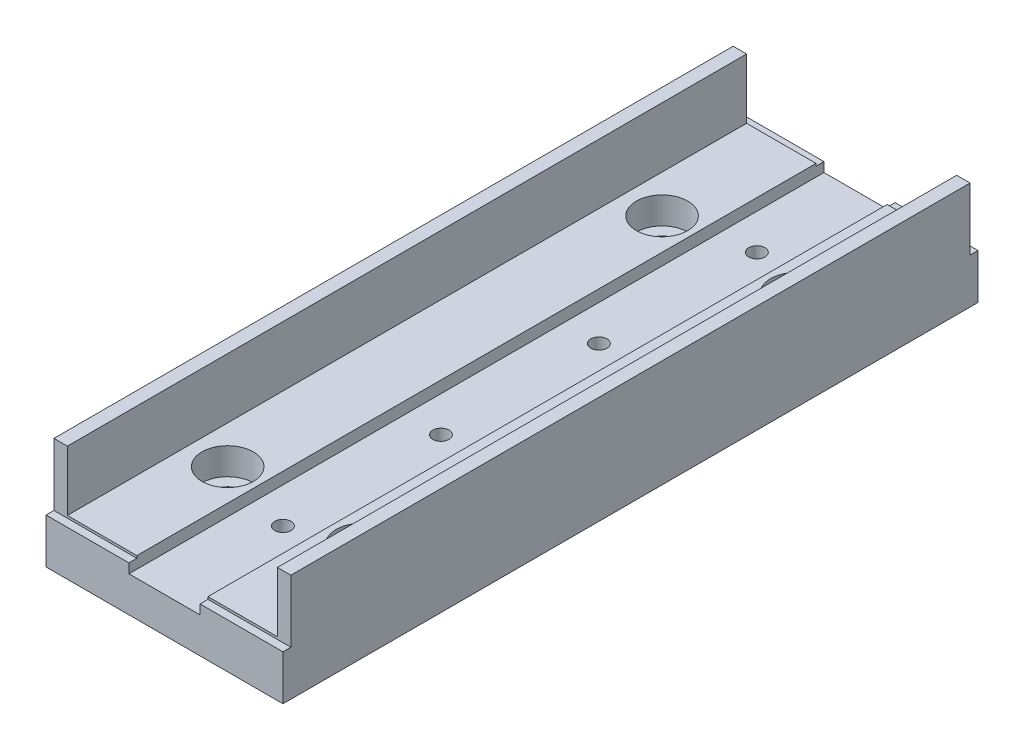
ISO-10303-21;
HEADER;
FILE_DESCRIPTION(('STEP AP214'),'2;1');
FILE_NAME('part.step','',(''),(''),'','','');
FILE_SCHEMA(('AUTOMOTIVE_DESIGN { 1 0 10303 214 1 1 1 1 }'));
ENDSEC;
DATA;
#1=APPLICATION_CONTEXT('core data for automotive mechanical design processes');
#2=APPLICATION_PROTOCOL_DEFINITION('international standard','automotive_design',2000,#1);
#3=PRODUCT_CONTEXT('',#1,'mechanical');
#4=PRODUCT('Part','Part','',(#3));
#5=PRODUCT_RELATED_PRODUCT_CATEGORY('part','',(#4));
#6=PRODUCT_DEFINITION_FORMATION('','',#4);
#7=PRODUCT_DEFINITION_CONTEXT('part definition',#1,'design');
#8=PRODUCT_DEFINITION('design','',#6,#7);
#9=PRODUCT_DEFINITION_SHAPE('','',#8);
#10=(LENGTH_UNIT() NAMED_UNIT(*) SI_UNIT(.MILLI.,.METRE.));
#11=(NAMED_UNIT(*) PLANE_ANGLE_UNIT() SI_UNIT($,.RADIAN.));
#12=(NAMED_UNIT(*) SI_UNIT($,.STERADIAN.) SOLID_ANGLE_UNIT());
#13=UNCERTAINTY_MEASURE_WITH_UNIT(LENGTH_MEASURE(1.E-05),#10,'distance_accuracy_value','');
#14=(GEOMETRIC_REPRESENTATION_CONTEXT(3) GLOBAL_UNCERTAINTY_ASSIGNED_CONTEXT((#13)) GLOBAL_UNIT_ASSIGNED_CONTEXT((#10,
#11,#12)) REPRESENTATION_CONTEXT('',''));
#15=CARTESIAN_POINT('',(0.,0.,0.));
#16=DIRECTION('',(0.,0.,1.));
#17=DIRECTION('',(1.,0.,0.));
#18=AXIS2_PLACEMENT_3D('',#15,#16,#17);
#19=CARTESIAN_POINT('',(-15.,-3.,88.));
#20=DIRECTION('',(0.,1.,0.));
#21=DIRECTION('',(0.,0.,1.));
#22=AXIS2_PLACEMENT_3D('',#19,#20,#21);
#23=PLANE('',#22);
#24=CARTESIAN_POINT('',(0.,-3.,33.));
#25=DIRECTION('',(0.,1.,0.));
#26=DIRECTION('',(0.,0.,1.));
#27=AXIS2_PLACEMENT_3D('',#24,#25,#26);
#28=CIRCLE('',#27,1.025);
#29=CARTESIAN_POINT('',(0.,-3.,34.025));
#30=VERTEX_POINT('',#29);
#31=EDGE_CURVE('E753',#30,#30,#28,.F.);
#32=ORIENTED_EDGE('',*,*,#31,.F.);
#33=EDGE_LOOP('',(#32));
#34=FACE_BOUND('',#33,.T.);
#35=CARTESIAN_POINT('',(0.,-3.,53.));
#36=DIRECTION('',(0.,1.,0.));
#37=DIRECTION('',(0.,0.,1.));
#38=AXIS2_PLACEMENT_3D('',#35,#36,#37);
#39=CIRCLE('',#38,1.025);
#40=CARTESIAN_POINT('',(0.,-3.,54.025));
#41=VERTEX_POINT('',#40);
#42=EDGE_CURVE('E468',#41,#41,#39,.F.);
#43=ORIENTED_EDGE('',*,*,#42,.F.);
#44=EDGE_LOOP('',(#43));
#45=FACE_BOUND('',#44,.T.);
#46=CARTESIAN_POINT('',(0.,-3.,73.));
#47=DIRECTION('',(0.,1.,0.));
#48=DIRECTION('',(0.,0.,1.));
#49=AXIS2_PLACEMENT_3D('',#46,#47,#48);
#50=CIRCLE('',#49,1.025);
#51=CARTESIAN_POINT('',(0.,-3.,74.025));
#52=VERTEX_POINT('',#51);
#53=EDGE_CURVE('E467',#52,#52,#50,.F.);
#54=ORIENTED_EDGE('',*,*,#53,.F.);
#55=EDGE_LOOP('',(#54));
#56=FACE_BOUND('',#55,.T.);
#57=CARTESIAN_POINT('',(-8.50000000000003,-3.,71.5));
#58=DIRECTION('',(0.,1.,0.));
#59=DIRECTION('',(0.,0.,1.));
#60=AXIS2_PLACEMENT_3D('',#57,#58,#59);
#61=CIRCLE('',#60,1.7);
#62=CARTESIAN_POINT('',(-8.50000000000003,-3.,73.2));
#63=VERTEX_POINT('',#62);
#64=EDGE_CURVE('E477',#63,#63,#61,.F.);
#65=ORIENTED_EDGE('',*,*,#64,.F.);
#66=EDGE_LOOP('',(#65));
#67=FACE_BOUND('',#66,.T.);
#68=CARTESIAN_POINT('',(8.49999999999997,-3.,71.5));
#69=DIRECTION('',(0.,1.,0.));
#70=DIRECTION('',(0.,0.,1.));
#71=AXIS2_PLACEMENT_3D('',#68,#69,#70);
#72=CIRCLE('',#71,1.7);
#73=CARTESIAN_POINT('',(8.49999999999997,-3.,73.2));
#74=VERTEX_POINT('',#73);
#75=EDGE_CURVE('E489',#74,#74,#72,.F.);
#76=ORIENTED_EDGE('',*,*,#75,.F.);
#77=EDGE_LOOP('',(#76));
#78=FACE_BOUND('',#77,.T.);
#79=CARTESIAN_POINT('',(8.49999999999997,-3.,16.5));
#80=DIRECTION('',(0.,1.,0.));
#81=DIRECTION('',(0.,0.,1.));
#82=AXIS2_PLACEMENT_3D('',#79,#80,#81);
#83=CIRCLE('',#82,1.7);
#84=CARTESIAN_POINT('',(8.49999999999997,-3.,18.2));
#85=VERTEX_POINT('',#84);
#86=EDGE_CURVE('E501',#85,#85,#83,.F.);
#87=ORIENTED_EDGE('',*,*,#86,.F.);
#88=EDGE_LOOP('',(#87));
#89=FACE_BOUND('',#88,.T.);
#90=CARTESIAN_POINT('',(-8.50000000000003,-3.,16.5));
#91=DIRECTION('',(0.,1.,0.));
#92=DIRECTION('',(0.,0.,1.));
#93=AXIS2_PLACEMENT_3D('',#90,#91,#92);
#94=CIRCLE('',#93,1.7);
#95=CARTESIAN_POINT('',(-8.50000000000003,-3.,18.2));
#96=VERTEX_POINT('',#95);
#97=EDGE_CURVE('E352',#96,#96,#94,.F.);
#98=ORIENTED_EDGE('',*,*,#97,.F.);
#99=EDGE_LOOP('',(#98));
#100=FACE_BOUND('',#99,.T.);
#101=DIRECTION('',(1.,0.,0.));
#102=VECTOR('',#101,1.);
#103=CARTESIAN_POINT('',(-15.,-3.,0.));
#104=LINE('',#103,#102);
#105=CARTESIAN_POINT('',(-15.,-3.,0.));
#106=VERTEX_POINT('',#105);
#107=CARTESIAN_POINT('',(15.,-3.,0.));
#108=VERTEX_POINT('',#107);
#109=EDGE_CURVE('E209',#106,#108,#104,.T.);
#110=ORIENTED_EDGE('',*,*,#109,.T.);
#111=DIRECTION('',(0.,0.,-1.));
#112=VECTOR('',#111,1.);
#113=CARTESIAN_POINT('',(15.,-3.,88.));
#114=LINE('',#113,#112);
#115=CARTESIAN_POINT('',(15.,-3.,88.));
#116=VERTEX_POINT('',#115);
#117=EDGE_CURVE('E222',#116,#108,#114,.T.);
#118=ORIENTED_EDGE('',*,*,#117,.F.);
#119=DIRECTION('',(1.,0.,0.));
#120=VECTOR('',#119,1.);
#121=CARTESIAN_POINT('',(-15.,-3.,88.));
#122=LINE('',#121,#120);
#123=CARTESIAN_POINT('',(-15.,-3.,88.));
#124=VERTEX_POINT('',#123);
#125=EDGE_CURVE('E201',#124,#116,#122,.T.);
#126=ORIENTED_EDGE('',*,*,#125,.F.);
#127=DIRECTION('',(0.,0.,-1.));
#128=VECTOR('',#127,1.);
#129=CARTESIAN_POINT('',(-15.,-3.,88.));
#130=LINE('',#129,#128);
#131=EDGE_CURVE('E234',#124,#106,#130,.T.);
#132=ORIENTED_EDGE('',*,*,#131,.T.);
#133=EDGE_LOOP('',(#110,#118,#126,#132));
#134=FACE_BOUND('',#133,.T.);
#135=CARTESIAN_POINT('',(0.,-3.,13.));
#136=DIRECTION('',(0.,1.,0.));
#137=DIRECTION('',(0.,0.,1.));
#138=AXIS2_PLACEMENT_3D('',#135,#136,#137);
#139=CIRCLE('',#138,1.025);
#140=CARTESIAN_POINT('',(0.,-3.,14.025));
#141=VERTEX_POINT('',#140);
#142=EDGE_CURVE('E749',#141,#141,#139,.F.);
#143=ORIENTED_EDGE('',*,*,#142,.F.);
#144=EDGE_LOOP('',(#143));
#145=FACE_BOUND('',#144,.T.);
#146=ADVANCED_FACE('F48',(#34,#45,#56,#67,#78,#89,#100,#134,#145),#23,.F.);
#147=CARTESIAN_POINT('',(15.,10.6,88.));
#148=DIRECTION('',(0.,-1.,0.));
#149=DIRECTION('',(0.,0.,-1.));
#150=AXIS2_PLACEMENT_3D('',#147,#148,#149);
#151=PLANE('',#150);
#152=DIRECTION('',(0.,0.,-1.));
#153=VECTOR('',#152,1.);
#154=CARTESIAN_POINT('',(13.3,10.6,88.));
#155=LINE('',#154,#153);
#156=CARTESIAN_POINT('',(13.3,10.6,87.));
#157=VERTEX_POINT('',#156);
#158=CARTESIAN_POINT('',(13.3,10.6,1.));
#159=VERTEX_POINT('',#158);
#160=EDGE_CURVE('E261',#157,#159,#155,.T.);
#161=ORIENTED_EDGE('',*,*,#160,.F.);
#162=DIRECTION('',(-1.,0.,0.));
#163=VECTOR('',#162,1.);
#164=CARTESIAN_POINT('',(-15.,10.6,87.));
#165=LINE('',#164,#163);
#166=CARTESIAN_POINT('',(15.,10.6,87.));
#167=VERTEX_POINT('',#166);
#168=EDGE_CURVE('E346',#167,#157,#165,.T.);
#169=ORIENTED_EDGE('',*,*,#168,.F.);
#170=DIRECTION('',(0.,0.,-1.));
#171=VECTOR('',#170,1.);
#172=CARTESIAN_POINT('',(15.,10.6,88.));
#173=LINE('',#172,#171);
#174=CARTESIAN_POINT('',(14.9999999999999,10.6,1.));
#175=VERTEX_POINT('',#174);
#176=EDGE_CURVE('E264',#167,#175,#173,.T.);
#177=ORIENTED_EDGE('',*,*,#176,.T.);
#178=DIRECTION('',(1.,0.,0.));
#179=VECTOR('',#178,1.);
#180=CARTESIAN_POINT('',(-15.,10.6,1.));
#181=LINE('',#180,#179);
#182=EDGE_CURVE('E347',#159,#175,#181,.T.);
#183=ORIENTED_EDGE('',*,*,#182,.F.);
#184=EDGE_LOOP('',(#161,#169,#177,#183));
#185=FACE_BOUND('',#184,.T.);
#186=ADVANCED_FACE('F50',(#185),#151,.F.);
#187=CARTESIAN_POINT('',(13.3,3.00000000000009,88.));
#188=DIRECTION('',(1.,0.,0.));
#189=DIRECTION('',(0.,1.,0.));
#190=AXIS2_PLACEMENT_3D('',#187,#188,#189);
#191=PLANE('',#190);
#192=DIRECTION('',(0.,0.,-1.));
#193=VECTOR('',#192,1.);
#194=CARTESIAN_POINT('',(13.3,3.00000000000009,88.));
#195=LINE('',#194,#193);
#196=CARTESIAN_POINT('',(13.3,3.00000000000009,87.));
#197=VERTEX_POINT('',#196);
#198=CARTESIAN_POINT('',(13.3,3.00000000000009,1.));
#199=VERTEX_POINT('',#198);
#200=EDGE_CURVE('E258',#197,#199,#195,.T.);
#201=ORIENTED_EDGE('',*,*,#200,.F.);
#202=DIRECTION('',(0.,1.,0.));
#203=VECTOR('',#202,1.);
#204=CARTESIAN_POINT('',(13.3,3.00000000000009,87.));
#205=LINE('',#204,#203);
#206=EDGE_CURVE('E212',#197,#157,#205,.T.);
#207=ORIENTED_EDGE('',*,*,#206,.T.);
#208=ORIENTED_EDGE('',*,*,#160,.T.);
#209=DIRECTION('',(0.,-1.,0.));
#210=VECTOR('',#209,1.);
#211=CARTESIAN_POINT('',(13.3,3.00000000000009,1.));
#212=LINE('',#211,#210);
#213=EDGE_CURVE('E320',#159,#199,#212,.T.);
#214=ORIENTED_EDGE('',*,*,#213,.T.);
#215=EDGE_LOOP('',(#201,#207,#208,#214));
#216=FACE_BOUND('',#215,.T.);
#217=ADVANCED_FACE('F341',(#216),#191,.F.);
#218=CARTESIAN_POINT('',(4.5,3.,88.));
#219=DIRECTION('',(0.,-1.,0.));
#220=DIRECTION('',(1.,0.,0.));
#221=AXIS2_PLACEMENT_3D('',#218,#219,#220);
#222=PLANE('',#221);
#223=CARTESIAN_POINT('',(8.49999999999997,3.00000000000004,71.5));
#224=DIRECTION('',(0.,1.,0.));
#225=DIRECTION('',(0.,0.,1.));
#226=AXIS2_PLACEMENT_3D('',#223,#224,#225);
#227=CIRCLE('',#226,3.25);
#228=CARTESIAN_POINT('',(8.49999999999997,3.00000000000004,74.75));
#229=VERTEX_POINT('',#228);
#230=EDGE_CURVE('E480',#229,#229,#227,.T.);
#231=ORIENTED_EDGE('',*,*,#230,.F.);
#232=EDGE_LOOP('',(#231));
#233=FACE_BOUND('',#232,.T.);
#234=CARTESIAN_POINT('',(8.49999999999997,3.00000000000004,16.5));
#235=DIRECTION('',(0.,1.,0.));
#236=DIRECTION('',(0.,0.,1.));
#237=AXIS2_PLACEMENT_3D('',#234,#235,#236);
#238=CIRCLE('',#237,3.25);
#239=CARTESIAN_POINT('',(8.49999999999997,3.00000000000004,19.75));
#240=VERTEX_POINT('',#239);
#241=EDGE_CURVE('E492',#240,#240,#238,.T.);
#242=ORIENTED_EDGE('',*,*,#241,.F.);
#243=EDGE_LOOP('',(#242));
#244=FACE_BOUND('',#243,.T.);
#245=DIRECTION('',(0.,0.,-1.));
#246=VECTOR('',#245,1.);
#247=CARTESIAN_POINT('',(4.5,3.,88.));
#248=LINE('',#247,#246);
#249=CARTESIAN_POINT('',(4.5,3.,87.));
#250=VERTEX_POINT('',#249);
#251=CARTESIAN_POINT('',(4.5,3.,1.));
#252=VERTEX_POINT('',#251);
#253=EDGE_CURVE('E255',#250,#252,#248,.T.);
#254=ORIENTED_EDGE('',*,*,#253,.F.);
#255=DIRECTION('',(1.,0.,0.));
#256=VECTOR('',#255,1.);
#257=CARTESIAN_POINT('',(4.5,3.,87.));
#258=LINE('',#257,#256);
#259=EDGE_CURVE('E333',#250,#197,#258,.T.);
#260=ORIENTED_EDGE('',*,*,#259,.T.);
#261=ORIENTED_EDGE('',*,*,#200,.T.);
#262=DIRECTION('',(-1.,0.,0.));
#263=VECTOR('',#262,1.);
#264=CARTESIAN_POINT('',(4.5,3.,1.));
#265=LINE('',#264,#263);
#266=EDGE_CURVE('E317',#199,#252,#265,.T.);
#267=ORIENTED_EDGE('',*,*,#266,.T.);
#268=EDGE_LOOP('',(#254,#260,#261,#267));
#269=FACE_BOUND('',#268,.T.);
#270=ADVANCED_FACE('F411',(#233,#244,#269),#222,.F.);
#271=CARTESIAN_POINT('',(4.5,1.5,88.));
#272=DIRECTION('',(1.,0.,0.));
#273=DIRECTION('',(0.,1.,0.));
#274=AXIS2_PLACEMENT_3D('',#271,#272,#273);
#275=PLANE('',#274);
#276=DIRECTION('',(0.,-1.,0.));
#277=VECTOR('',#276,1.);
#278=CARTESIAN_POINT('',(4.5,1.5,88.));
#279=LINE('',#278,#277);
#280=CARTESIAN_POINT('',(4.5,2.7,88.));
#281=VERTEX_POINT('',#280);
#282=CARTESIAN_POINT('',(4.5,1.5,88.));
#283=VERTEX_POINT('',#282);
#284=EDGE_CURVE('E203',#281,#283,#279,.T.);
#285=ORIENTED_EDGE('',*,*,#284,.F.);
#286=DIRECTION('',(0.,0.,-1.));
#287=VECTOR('',#286,1.);
#288=CARTESIAN_POINT('',(4.5,2.7,88.));
#289=LINE('',#288,#287);
#290=CARTESIAN_POINT('',(4.5,2.7,87.));
#291=VERTEX_POINT('',#290);
#292=EDGE_CURVE('E70',#281,#291,#289,.T.);
#293=ORIENTED_EDGE('',*,*,#292,.T.);
#294=DIRECTION('',(0.,1.,0.));
#295=VECTOR('',#294,1.);
#296=CARTESIAN_POINT('',(4.5,1.5,87.));
#297=LINE('',#296,#295);
#298=EDGE_CURVE('E331',#291,#250,#297,.T.);
#299=ORIENTED_EDGE('',*,*,#298,.T.);
#300=ORIENTED_EDGE('',*,*,#253,.T.);
#301=DIRECTION('',(0.,-1.,0.));
#302=VECTOR('',#301,1.);
#303=CARTESIAN_POINT('',(4.5,1.5,1.));
#304=LINE('',#303,#302);
#305=CARTESIAN_POINT('',(4.5,2.7,1.));
#306=VERTEX_POINT('',#305);
#307=EDGE_CURVE('E298',#252,#306,#304,.T.);
#308=ORIENTED_EDGE('',*,*,#307,.T.);
#309=DIRECTION('',(0.,0.,-1.));
#310=VECTOR('',#309,1.);
#311=CARTESIAN_POINT('',(4.5,2.7,88.));
#312=LINE('',#311,#310);
#313=CARTESIAN_POINT('',(4.5,2.7,0.));
#314=VERTEX_POINT('',#313);
#315=EDGE_CURVE('E297',#306,#314,#312,.T.);
#316=ORIENTED_EDGE('',*,*,#315,.T.);
#317=DIRECTION('',(0.,-1.,0.));
#318=VECTOR('',#317,1.);
#319=CARTESIAN_POINT('',(4.5,1.5,0.));
#320=LINE('',#319,#318);
#321=CARTESIAN_POINT('',(4.5,1.5,0.));
#322=VERTEX_POINT('',#321);
#323=EDGE_CURVE('E223',#314,#322,#320,.T.);
#324=ORIENTED_EDGE('',*,*,#323,.T.);
#325=DIRECTION('',(0.,0.,-1.));
#326=VECTOR('',#325,1.);
#327=CARTESIAN_POINT('',(4.5,1.5,88.));
#328=LINE('',#327,#326);
#329=EDGE_CURVE('E252',#283,#322,#328,.T.);
#330=ORIENTED_EDGE('',*,*,#329,.F.);
#331=EDGE_LOOP('',(#285,#293,#299,#300,#308,#316,#324,#330));
#332=FACE_BOUND('',#331,.T.);
#333=ADVANCED_FACE('F295',(#332),#275,.F.);
#334=CARTESIAN_POINT('',(-4.5,1.5,88.));
#335=DIRECTION('',(0.,-1.,0.));
#336=DIRECTION('',(1.,0.,0.));
#337=AXIS2_PLACEMENT_3D('',#334,#335,#336);
#338=PLANE('',#337);
#339=CARTESIAN_POINT('',(0.,1.5,13.));
#340=DIRECTION('',(0.,1.,0.));
#341=DIRECTION('',(0.,0.,1.));
#342=AXIS2_PLACEMENT_3D('',#339,#340,#341);
#343=CIRCLE('',#342,1.025);
#344=CARTESIAN_POINT('',(0.,1.5,14.025));
#345=VERTEX_POINT('',#344);
#346=EDGE_CURVE('E454',#345,#345,#343,.T.);
#347=ORIENTED_EDGE('',*,*,#346,.F.);
#348=EDGE_LOOP('',(#347));
#349=FACE_BOUND('',#348,.T.);
#350=CARTESIAN_POINT('',(0.,1.5,33.));
#351=DIRECTION('',(0.,1.,0.));
#352=DIRECTION('',(0.,0.,1.));
#353=AXIS2_PLACEMENT_3D('',#350,#351,#352);
#354=CIRCLE('',#353,1.025);
#355=CARTESIAN_POINT('',(0.,1.5,34.025));
#356=VERTEX_POINT('',#355);
#357=EDGE_CURVE('E458',#356,#356,#354,.T.);
#358=ORIENTED_EDGE('',*,*,#357,.F.);
#359=EDGE_LOOP('',(#358));
#360=FACE_BOUND('',#359,.T.);
#361=CARTESIAN_POINT('',(0.,1.5,53.));
#362=DIRECTION('',(0.,1.,0.));
#363=DIRECTION('',(0.,0.,1.));
#364=AXIS2_PLACEMENT_3D('',#361,#362,#363);
#365=CIRCLE('',#364,1.025);
#366=CARTESIAN_POINT('',(0.,1.5,54.025));
#367=VERTEX_POINT('',#366);
#368=EDGE_CURVE('E462',#367,#367,#365,.T.);
#369=ORIENTED_EDGE('',*,*,#368,.F.);
#370=EDGE_LOOP('',(#369));
#371=FACE_BOUND('',#370,.T.);
#372=CARTESIAN_POINT('',(0.,1.5,73.));
#373=DIRECTION('',(0.,1.,0.));
#374=DIRECTION('',(0.,0.,1.));
#375=AXIS2_PLACEMENT_3D('',#372,#373,#374);
#376=CIRCLE('',#375,1.025);
#377=CARTESIAN_POINT('',(0.,1.5,74.025));
#378=VERTEX_POINT('',#377);
#379=EDGE_CURVE('E465',#378,#378,#376,.T.);
#380=ORIENTED_EDGE('',*,*,#379,.F.);
#381=EDGE_LOOP('',(#380));
#382=FACE_BOUND('',#381,.T.);
#383=DIRECTION('',(-1.,0.,0.));
#384=VECTOR('',#383,1.);
#385=CARTESIAN_POINT('',(-4.5,1.5,0.));
#386=LINE('',#385,#384);
#387=CARTESIAN_POINT('',(-4.5,1.5,0.));
#388=VERTEX_POINT('',#387);
#389=EDGE_CURVE('E225',#322,#388,#386,.T.);
#390=ORIENTED_EDGE('',*,*,#389,.T.);
#391=DIRECTION('',(0.,0.,-1.));
#392=VECTOR('',#391,1.);
#393=CARTESIAN_POINT('',(-4.5,1.5,88.));
#394=LINE('',#393,#392);
#395=CARTESIAN_POINT('',(-4.5,1.5,88.));
#396=VERTEX_POINT('',#395);
#397=EDGE_CURVE('E249',#396,#388,#394,.T.);
#398=ORIENTED_EDGE('',*,*,#397,.F.);
#399=DIRECTION('',(-1.,0.,0.));
#400=VECTOR('',#399,1.);
#401=CARTESIAN_POINT('',(-4.5,1.5,88.));
#402=LINE('',#401,#400);
#403=EDGE_CURVE('E206',#283,#396,#402,.T.);
#404=ORIENTED_EDGE('',*,*,#403,.F.);
#405=ORIENTED_EDGE('',*,*,#329,.T.);
#406=EDGE_LOOP('',(#390,#398,#404,#405));
#407=FACE_BOUND('',#406,.T.);
#408=ADVANCED_FACE('F287',(#349,#360,#371,#382,#407),#338,.F.);
#409=CARTESIAN_POINT('',(-4.5,3.,88.));
#410=DIRECTION('',(-1.,0.,0.));
#411=DIRECTION('',(0.,0.,1.));
#412=AXIS2_PLACEMENT_3D('',#409,#410,#411);
#413=PLANE('',#412);
#414=DIRECTION('',(0.,-1.,0.));
#415=VECTOR('',#414,1.);
#416=CARTESIAN_POINT('',(-4.5,3.,87.));
#417=LINE('',#416,#415);
#418=CARTESIAN_POINT('',(-4.5,3.,87.));
#419=VERTEX_POINT('',#418);
#420=CARTESIAN_POINT('',(-4.5,2.7,87.));
#421=VERTEX_POINT('',#420);
#422=EDGE_CURVE('E329',#419,#421,#417,.T.);
#423=ORIENTED_EDGE('',*,*,#422,.T.);
#424=DIRECTION('',(0.,0.,1.));
#425=VECTOR('',#424,1.);
#426=CARTESIAN_POINT('',(-4.5,2.7,88.));
#427=LINE('',#426,#425);
#428=CARTESIAN_POINT('',(-4.5,2.7,88.));
#429=VERTEX_POINT('',#428);
#430=EDGE_CURVE('E301',#421,#429,#427,.T.);
#431=ORIENTED_EDGE('',*,*,#430,.T.);
#432=DIRECTION('',(0.,1.,0.));
#433=VECTOR('',#432,1.);
#434=CARTESIAN_POINT('',(-4.5,3.,88.));
#435=LINE('',#434,#433);
#436=EDGE_CURVE('E216',#396,#429,#435,.T.);
#437=ORIENTED_EDGE('',*,*,#436,.F.);
#438=ORIENTED_EDGE('',*,*,#397,.T.);
#439=DIRECTION('',(0.,1.,0.));
#440=VECTOR('',#439,1.);
#441=CARTESIAN_POINT('',(-4.5,3.,0.));
#442=LINE('',#441,#440);
#443=CARTESIAN_POINT('',(-4.5,2.7,0.));
#444=VERTEX_POINT('',#443);
#445=EDGE_CURVE('E227',#388,#444,#442,.T.);
#446=ORIENTED_EDGE('',*,*,#445,.T.);
#447=DIRECTION('',(0.,0.,1.));
#448=VECTOR('',#447,1.);
#449=CARTESIAN_POINT('',(-4.5,2.7,88.));
#450=LINE('',#449,#448);
#451=CARTESIAN_POINT('',(-4.5,2.7,1.));
#452=VERTEX_POINT('',#451);
#453=EDGE_CURVE('E281',#444,#452,#450,.T.);
#454=ORIENTED_EDGE('',*,*,#453,.T.);
#455=DIRECTION('',(0.,1.,0.));
#456=VECTOR('',#455,1.);
#457=CARTESIAN_POINT('',(-4.5,3.,1.));
#458=LINE('',#457,#456);
#459=CARTESIAN_POINT('',(-4.5,3.,1.));
#460=VERTEX_POINT('',#459);
#461=EDGE_CURVE('E314',#452,#460,#458,.T.);
#462=ORIENTED_EDGE('',*,*,#461,.T.);
#463=DIRECTION('',(0.,0.,-1.));
#464=VECTOR('',#463,1.);
#465=CARTESIAN_POINT('',(-4.5,3.,88.));
#466=LINE('',#465,#464);
#467=EDGE_CURVE('E246',#419,#460,#466,.T.);
#468=ORIENTED_EDGE('',*,*,#467,.F.);
#469=EDGE_LOOP('',(#423,#431,#437,#438,#446,#454,#462,#468));
#470=FACE_BOUND('',#469,.T.);
#471=ADVANCED_FACE('F279',(#470),#413,.F.);
#472=CARTESIAN_POINT('',(-13.3,3.,88.));
#473=DIRECTION('',(0.,-1.,0.));
#474=DIRECTION('',(0.,0.,-1.));
#475=AXIS2_PLACEMENT_3D('',#472,#473,#474);
#476=PLANE('',#475);
#477=CARTESIAN_POINT('',(-8.50000000000003,2.99999999999986,71.5));
#478=DIRECTION('',(0.,1.,0.));
#479=DIRECTION('',(0.,0.,1.));
#480=AXIS2_PLACEMENT_3D('',#477,#478,#479);
#481=CIRCLE('',#480,3.25);
#482=CARTESIAN_POINT('',(-8.50000000000003,2.99999999999986,74.75));
#483=VERTEX_POINT('',#482);
#484=EDGE_CURVE('E471',#483,#483,#481,.T.);
#485=ORIENTED_EDGE('',*,*,#484,.F.);
#486=EDGE_LOOP('',(#485));
#487=FACE_BOUND('',#486,.T.);
#488=CARTESIAN_POINT('',(-8.50000000000003,2.99999999999986,16.5));
#489=DIRECTION('',(0.,1.,0.));
#490=DIRECTION('',(0.,0.,1.));
#491=AXIS2_PLACEMENT_3D('',#488,#489,#490);
#492=CIRCLE('',#491,3.25);
#493=CARTESIAN_POINT('',(-8.50000000000003,2.99999999999986,19.75));
#494=VERTEX_POINT('',#493);
#495=EDGE_CURVE('E504',#494,#494,#492,.T.);
#496=ORIENTED_EDGE('',*,*,#495,.F.);
#497=EDGE_LOOP('',(#496));
#498=FACE_BOUND('',#497,.T.);
#499=DIRECTION('',(0.,0.,-1.));
#500=VECTOR('',#499,1.);
#501=CARTESIAN_POINT('',(-13.3,3.,88.));
#502=LINE('',#501,#500);
#503=CARTESIAN_POINT('',(-13.3,3.,87.));
#504=VERTEX_POINT('',#503);
#505=CARTESIAN_POINT('',(-13.3,3.,1.));
#506=VERTEX_POINT('',#505);
#507=EDGE_CURVE('E243',#504,#506,#502,.T.);
#508=ORIENTED_EDGE('',*,*,#507,.F.);
#509=DIRECTION('',(1.,0.,0.));
#510=VECTOR('',#509,1.);
#511=CARTESIAN_POINT('',(-13.3,3.,87.));
#512=LINE('',#511,#510);
#513=EDGE_CURVE('E326',#504,#419,#512,.T.);
#514=ORIENTED_EDGE('',*,*,#513,.T.);
#515=ORIENTED_EDGE('',*,*,#467,.T.);
#516=DIRECTION('',(-1.,0.,0.));
#517=VECTOR('',#516,1.);
#518=CARTESIAN_POINT('',(-13.3,3.,1.));
#519=LINE('',#518,#517);
#520=EDGE_CURVE('E311',#460,#506,#519,.T.);
#521=ORIENTED_EDGE('',*,*,#520,.T.);
#522=EDGE_LOOP('',(#508,#514,#515,#521));
#523=FACE_BOUND('',#522,.T.);
#524=ADVANCED_FACE('F389',(#487,#498,#523),#476,.F.);
#525=CARTESIAN_POINT('',(-13.3,3.,88.));
#526=DIRECTION('',(-1.,0.,0.));
#527=DIRECTION('',(0.,0.,1.));
#528=AXIS2_PLACEMENT_3D('',#525,#526,#527);
#529=PLANE('',#528);
#530=DIRECTION('',(0.,0.,-1.));
#531=VECTOR('',#530,1.);
#532=CARTESIAN_POINT('',(-13.3,10.6,88.));
#533=LINE('',#532,#531);
#534=CARTESIAN_POINT('',(-13.3,10.6,87.));
#535=VERTEX_POINT('',#534);
#536=CARTESIAN_POINT('',(-13.3,10.6,1.));
#537=VERTEX_POINT('',#536);
#538=EDGE_CURVE('E240',#535,#537,#533,.T.);
#539=ORIENTED_EDGE('',*,*,#538,.F.);
#540=DIRECTION('',(0.,-1.,0.));
#541=VECTOR('',#540,1.);
#542=CARTESIAN_POINT('',(-13.3,3.,87.));
#543=LINE('',#542,#541);
#544=EDGE_CURVE('E323',#535,#504,#543,.T.);
#545=ORIENTED_EDGE('',*,*,#544,.T.);
#546=ORIENTED_EDGE('',*,*,#507,.T.);
#547=DIRECTION('',(0.,1.,0.));
#548=VECTOR('',#547,1.);
#549=CARTESIAN_POINT('',(-13.3,3.,1.));
#550=LINE('',#549,#548);
#551=EDGE_CURVE('E308',#506,#537,#550,.T.);
#552=ORIENTED_EDGE('',*,*,#551,.T.);
#553=EDGE_LOOP('',(#539,#545,#546,#552));
#554=FACE_BOUND('',#553,.T.);
#555=ADVANCED_FACE('F396',(#554),#529,.F.);
#556=CARTESIAN_POINT('',(-15.,10.6,88.));
#557=DIRECTION('',(0.,-1.,0.));
#558=DIRECTION('',(0.,0.,-1.));
#559=AXIS2_PLACEMENT_3D('',#556,#557,#558);
#560=PLANE('',#559);
#561=DIRECTION('',(0.,0.,-1.));
#562=VECTOR('',#561,1.);
#563=CARTESIAN_POINT('',(-15.,10.6,88.));
#564=LINE('',#563,#562);
#565=CARTESIAN_POINT('',(-15.,10.6,87.));
#566=VERTEX_POINT('',#565);
#567=CARTESIAN_POINT('',(-15.,10.6,1.));
#568=VERTEX_POINT('',#567);
#569=EDGE_CURVE('E237',#566,#568,#564,.T.);
#570=ORIENTED_EDGE('',*,*,#569,.F.);
#571=EDGE_CURVE('E364',#535,#566,#165,.T.);
#572=ORIENTED_EDGE('',*,*,#571,.F.);
#573=ORIENTED_EDGE('',*,*,#538,.T.);
#574=EDGE_CURVE('E351',#568,#537,#181,.T.);
#575=ORIENTED_EDGE('',*,*,#574,.F.);
#576=EDGE_LOOP('',(#570,#572,#573,#575));
#577=FACE_BOUND('',#576,.T.);
#578=ADVANCED_FACE('F399',(#577),#560,.F.);
#579=CARTESIAN_POINT('',(-15.,-3.,88.));
#580=DIRECTION('',(1.,0.,0.));
#581=DIRECTION('',(0.,0.,-1.));
#582=AXIS2_PLACEMENT_3D('',#579,#580,#581);
#583=PLANE('',#582);
#584=DIRECTION('',(0.,-1.,0.));
#585=VECTOR('',#584,1.);
#586=CARTESIAN_POINT('',(-15.,3.,88.));
#587=LINE('',#586,#585);
#588=CARTESIAN_POINT('',(-15.,2.7,88.));
#589=VERTEX_POINT('',#588);
#590=EDGE_CURVE('E219',#589,#124,#587,.T.);
#591=ORIENTED_EDGE('',*,*,#590,.F.);
#592=DIRECTION('',(0.,0.,1.));
#593=VECTOR('',#592,1.);
#594=CARTESIAN_POINT('',(-15.,2.7,88.));
#595=LINE('',#594,#593);
#596=CARTESIAN_POINT('',(-15.,2.7,87.));
#597=VERTEX_POINT('',#596);
#598=EDGE_CURVE('E63',#597,#589,#595,.T.);
#599=ORIENTED_EDGE('',*,*,#598,.F.);
#600=DIRECTION('',(0.,1.,0.));
#601=VECTOR('',#600,1.);
#602=CARTESIAN_POINT('',(-15.,-27.6166620396073,87.));
#603=LINE('',#602,#601);
#604=EDGE_CURVE('E408',#597,#566,#603,.T.);
#605=ORIENTED_EDGE('',*,*,#604,.T.);
#606=ORIENTED_EDGE('',*,*,#569,.T.);
#607=DIRECTION('',(0.,1.,0.));
#608=VECTOR('',#607,1.);
#609=CARTESIAN_POINT('',(-15.,-27.6166620396073,1.));
#610=LINE('',#609,#608);
#611=CARTESIAN_POINT('',(-15.,2.7,1.));
#612=VERTEX_POINT('',#611);
#613=EDGE_CURVE('E362',#612,#568,#610,.T.);
#614=ORIENTED_EDGE('',*,*,#613,.F.);
#615=DIRECTION('',(0.,0.,1.));
#616=VECTOR('',#615,1.);
#617=CARTESIAN_POINT('',(-15.,2.7,0.));
#618=LINE('',#617,#616);
#619=CARTESIAN_POINT('',(-15.,2.7,0.));
#620=VERTEX_POINT('',#619);
#621=EDGE_CURVE('E354',#620,#612,#618,.T.);
#622=ORIENTED_EDGE('',*,*,#621,.F.);
#623=DIRECTION('',(0.,-1.,0.));
#624=VECTOR('',#623,1.);
#625=CARTESIAN_POINT('',(-15.,-3.,0.));
#626=LINE('',#625,#624);
#627=EDGE_CURVE('E230',#620,#106,#626,.T.);
#628=ORIENTED_EDGE('',*,*,#627,.T.);
#629=ORIENTED_EDGE('',*,*,#131,.F.);
#630=EDGE_LOOP('',(#591,#599,#605,#606,#614,#622,#628,#629));
#631=FACE_BOUND('',#630,.T.);
#632=ADVANCED_FACE('F383',(#631),#583,.F.);
#633=CARTESIAN_POINT('',(15.,-3.,88.));
#634=DIRECTION('',(-1.,0.,0.));
#635=DIRECTION('',(0.,0.,1.));
#636=AXIS2_PLACEMENT_3D('',#633,#634,#635);
#637=PLANE('',#636);
#638=DIRECTION('',(0.,1.,0.));
#639=VECTOR('',#638,1.);
#640=CARTESIAN_POINT('',(15.,-27.6166620396073,87.));
#641=LINE('',#640,#639);
#642=CARTESIAN_POINT('',(15.,2.7,87.));
#643=VERTEX_POINT('',#642);
#644=EDGE_CURVE('E196',#643,#167,#641,.T.);
#645=ORIENTED_EDGE('',*,*,#644,.F.);
#646=DIRECTION('',(0.,0.,-1.));
#647=VECTOR('',#646,1.);
#648=CARTESIAN_POINT('',(15.,2.7,88.));
#649=LINE('',#648,#647);
#650=CARTESIAN_POINT('',(15.,2.7,88.));
#651=VERTEX_POINT('',#650);
#652=EDGE_CURVE('E185',#651,#643,#649,.T.);
#653=ORIENTED_EDGE('',*,*,#652,.F.);
#654=DIRECTION('',(0.,1.,0.));
#655=VECTOR('',#654,1.);
#656=CARTESIAN_POINT('',(15.,3.,88.));
#657=LINE('',#656,#655);
#658=EDGE_CURVE('E193',#116,#651,#657,.T.);
#659=ORIENTED_EDGE('',*,*,#658,.F.);
#660=ORIENTED_EDGE('',*,*,#117,.T.);
#661=DIRECTION('',(0.,1.,0.));
#662=VECTOR('',#661,1.);
#663=CARTESIAN_POINT('',(15.,-3.,0.));
#664=LINE('',#663,#662);
#665=CARTESIAN_POINT('',(15.,2.7,0.));
#666=VERTEX_POINT('',#665);
#667=EDGE_CURVE('E204',#108,#666,#664,.T.);
#668=ORIENTED_EDGE('',*,*,#667,.T.);
#669=DIRECTION('',(0.,0.,-1.));
#670=VECTOR('',#669,1.);
#671=CARTESIAN_POINT('',(14.9999999999999,2.7,0.));
#672=LINE('',#671,#670);
#673=CARTESIAN_POINT('',(14.9999999999999,2.7,1.));
#674=VERTEX_POINT('',#673);
#675=EDGE_CURVE('E365',#674,#666,#672,.T.);
#676=ORIENTED_EDGE('',*,*,#675,.F.);
#677=DIRECTION('',(0.,1.,0.));
#678=VECTOR('',#677,1.);
#679=CARTESIAN_POINT('',(14.9999999999999,-27.6166620396073,1.));
#680=LINE('',#679,#678);
#681=EDGE_CURVE('E367',#674,#175,#680,.T.);
#682=ORIENTED_EDGE('',*,*,#681,.T.);
#683=ORIENTED_EDGE('',*,*,#176,.F.);
#684=EDGE_LOOP('',(#645,#653,#659,#660,#668,#676,#682,#683));
#685=FACE_BOUND('',#684,.T.);
#686=ADVANCED_FACE('F191',(#685),#637,.F.);
#687=CARTESIAN_POINT('',(0.,0.,88.));
#688=DIRECTION('',(0.,0.,1.));
#689=DIRECTION('',(1.,0.,0.));
#690=AXIS2_PLACEMENT_3D('',#687,#688,#689);
#691=PLANE('',#690);
#692=DIRECTION('',(1.,0.,0.));
#693=VECTOR('',#692,1.);
#694=CARTESIAN_POINT('',(-15.,2.7,88.));
#695=LINE('',#694,#693);
#696=EDGE_CURVE('E197',#589,#429,#695,.T.);
#697=ORIENTED_EDGE('',*,*,#696,.F.);
#698=ORIENTED_EDGE('',*,*,#590,.T.);
#699=ORIENTED_EDGE('',*,*,#125,.T.);
#700=ORIENTED_EDGE('',*,*,#658,.T.);
#701=DIRECTION('',(1.,0.,0.));
#702=VECTOR('',#701,1.);
#703=CARTESIAN_POINT('',(0.,2.7,88.));
#704=LINE('',#703,#702);
#705=EDGE_CURVE('E13',#281,#651,#704,.T.);
#706=ORIENTED_EDGE('',*,*,#705,.F.);
#707=ORIENTED_EDGE('',*,*,#284,.T.);
#708=ORIENTED_EDGE('',*,*,#403,.T.);
#709=ORIENTED_EDGE('',*,*,#436,.T.);
#710=EDGE_LOOP('',(#697,#698,#699,#700,#706,#707,#708,#709));
#711=FACE_BOUND('',#710,.T.);
#712=ADVANCED_FACE('F199',(#711),#691,.T.);
#713=CARTESIAN_POINT('',(0.,0.,0.));
#714=DIRECTION('',(0.,0.,1.));
#715=DIRECTION('',(1.,0.,0.));
#716=AXIS2_PLACEMENT_3D('',#713,#714,#715);
#717=PLANE('',#716);
#718=ORIENTED_EDGE('',*,*,#627,.F.);
#719=DIRECTION('',(1.,0.,0.));
#720=VECTOR('',#719,1.);
#721=CARTESIAN_POINT('',(0.,2.7,0.));
#722=LINE('',#721,#720);
#723=EDGE_CURVE('E56',#620,#444,#722,.T.);
#724=ORIENTED_EDGE('',*,*,#723,.T.);
#725=ORIENTED_EDGE('',*,*,#445,.F.);
#726=ORIENTED_EDGE('',*,*,#389,.F.);
#727=ORIENTED_EDGE('',*,*,#323,.F.);
#728=DIRECTION('',(-1.,0.,0.));
#729=VECTOR('',#728,1.);
#730=CARTESIAN_POINT('',(-15.,2.7,0.));
#731=LINE('',#730,#729);
#732=EDGE_CURVE('E292',#666,#314,#731,.T.);
#733=ORIENTED_EDGE('',*,*,#732,.F.);
#734=ORIENTED_EDGE('',*,*,#667,.F.);
#735=ORIENTED_EDGE('',*,*,#109,.F.);
#736=EDGE_LOOP('',(#718,#724,#725,#726,#727,#733,#734,#735));
#737=FACE_BOUND('',#736,.T.);
#738=ADVANCED_FACE('F270',(#737),#717,.F.);
#739=CARTESIAN_POINT('',(-13.3,2.7,88.));
#740=DIRECTION('',(0.,-1.,0.));
#741=DIRECTION('',(0.,0.,-1.));
#742=AXIS2_PLACEMENT_3D('',#739,#740,#741);
#743=PLANE('',#742);
#744=DIRECTION('',(1.,0.,0.));
#745=VECTOR('',#744,1.);
#746=CARTESIAN_POINT('',(-15.,2.7,1.));
#747=LINE('',#746,#745);
#748=EDGE_CURVE('E371',#306,#674,#747,.T.);
#749=ORIENTED_EDGE('',*,*,#748,.T.);
#750=ORIENTED_EDGE('',*,*,#675,.T.);
#751=ORIENTED_EDGE('',*,*,#732,.T.);
#752=ORIENTED_EDGE('',*,*,#315,.F.);
#753=EDGE_LOOP('',(#749,#750,#751,#752));
#754=FACE_BOUND('',#753,.T.);
#755=ADVANCED_FACE('F375',(#754),#743,.F.);
#756=CARTESIAN_POINT('',(-15.,-27.6166620396073,1.));
#757=DIRECTION('',(0.,0.,1.));
#758=DIRECTION('',(1.,0.,0.));
#759=AXIS2_PLACEMENT_3D('',#756,#757,#758);
#760=PLANE('',#759);
#761=ORIENTED_EDGE('',*,*,#182,.T.);
#762=ORIENTED_EDGE('',*,*,#681,.F.);
#763=ORIENTED_EDGE('',*,*,#748,.F.);
#764=ORIENTED_EDGE('',*,*,#307,.F.);
#765=ORIENTED_EDGE('',*,*,#266,.F.);
#766=ORIENTED_EDGE('',*,*,#213,.F.);
#767=EDGE_LOOP('',(#761,#762,#763,#764,#765,#766));
#768=FACE_BOUND('',#767,.T.);
#769=ADVANCED_FACE('F377',(#768),#760,.F.);
#770=EDGE_CURVE('E368',#612,#452,#747,.T.);
#771=ORIENTED_EDGE('',*,*,#770,.F.);
#772=ORIENTED_EDGE('',*,*,#613,.T.);
#773=ORIENTED_EDGE('',*,*,#574,.T.);
#774=ORIENTED_EDGE('',*,*,#551,.F.);
#775=ORIENTED_EDGE('',*,*,#520,.F.);
#776=ORIENTED_EDGE('',*,*,#461,.F.);
#777=EDGE_LOOP('',(#771,#772,#773,#774,#775,#776));
#778=FACE_BOUND('',#777,.T.);
#779=ADVANCED_FACE('F385',(#778),#760,.F.);
#780=ORIENTED_EDGE('',*,*,#723,.F.);
#781=ORIENTED_EDGE('',*,*,#621,.T.);
#782=ORIENTED_EDGE('',*,*,#770,.T.);
#783=ORIENTED_EDGE('',*,*,#453,.F.);
#784=EDGE_LOOP('',(#780,#781,#782,#783));
#785=FACE_BOUND('',#784,.T.);
#786=ADVANCED_FACE('F384',(#785),#743,.F.);
#787=CARTESIAN_POINT('',(-13.3,2.7,88.));
#788=DIRECTION('',(0.,-1.,0.));
#789=DIRECTION('',(0.,0.,-1.));
#790=AXIS2_PLACEMENT_3D('',#787,#788,#789);
#791=PLANE('',#790);
#792=ORIENTED_EDGE('',*,*,#705,.T.);
#793=ORIENTED_EDGE('',*,*,#652,.T.);
#794=DIRECTION('',(-1.,0.,0.));
#795=VECTOR('',#794,1.);
#796=CARTESIAN_POINT('',(-15.,2.7,87.));
#797=LINE('',#796,#795);
#798=EDGE_CURVE('E409',#643,#291,#797,.T.);
#799=ORIENTED_EDGE('',*,*,#798,.T.);
#800=ORIENTED_EDGE('',*,*,#292,.F.);
#801=EDGE_LOOP('',(#792,#793,#799,#800));
#802=FACE_BOUND('',#801,.T.);
#803=ADVANCED_FACE('F184',(#802),#791,.F.);
#804=CARTESIAN_POINT('',(-15.,-27.6166620396073,87.));
#805=DIRECTION('',(0.,0.,-1.));
#806=DIRECTION('',(-1.,0.,0.));
#807=AXIS2_PLACEMENT_3D('',#804,#805,#806);
#808=PLANE('',#807);
#809=ORIENTED_EDGE('',*,*,#259,.F.);
#810=ORIENTED_EDGE('',*,*,#298,.F.);
#811=ORIENTED_EDGE('',*,*,#798,.F.);
#812=ORIENTED_EDGE('',*,*,#644,.T.);
#813=ORIENTED_EDGE('',*,*,#168,.T.);
#814=ORIENTED_EDGE('',*,*,#206,.F.);
#815=EDGE_LOOP('',(#809,#810,#811,#812,#813,#814));
#816=FACE_BOUND('',#815,.T.);
#817=ADVANCED_FACE('F539',(#816),#808,.F.);
#818=ORIENTED_EDGE('',*,*,#513,.F.);
#819=ORIENTED_EDGE('',*,*,#544,.F.);
#820=ORIENTED_EDGE('',*,*,#571,.T.);
#821=ORIENTED_EDGE('',*,*,#604,.F.);
#822=EDGE_CURVE('E410',#421,#597,#797,.T.);
#823=ORIENTED_EDGE('',*,*,#822,.F.);
#824=ORIENTED_EDGE('',*,*,#422,.F.);
#825=EDGE_LOOP('',(#818,#819,#820,#821,#823,#824));
#826=FACE_BOUND('',#825,.T.);
#827=ADVANCED_FACE('F391',(#826),#808,.F.);
#828=ORIENTED_EDGE('',*,*,#822,.T.);
#829=ORIENTED_EDGE('',*,*,#598,.T.);
#830=ORIENTED_EDGE('',*,*,#696,.T.);
#831=ORIENTED_EDGE('',*,*,#430,.F.);
#832=EDGE_LOOP('',(#828,#829,#830,#831));
#833=FACE_BOUND('',#832,.T.);
#834=ADVANCED_FACE('F534',(#833),#791,.F.);
#835=CARTESIAN_POINT('',(-8.50000000000003,2.99999999999986,16.5));
#836=DIRECTION('',(0.,1.,0.));
#837=DIRECTION('',(0.,0.,1.));
#838=AXIS2_PLACEMENT_3D('',#835,#836,#837);
#839=CYLINDRICAL_SURFACE('',#838,1.7);
#840=ORIENTED_EDGE('',*,*,#97,.T.);
#841=EDGE_LOOP('',(#840));
#842=FACE_BOUND('',#841,.T.);
#843=CARTESIAN_POINT('',(-8.50000000000003,-0.400000000000135,16.5));
#844=DIRECTION('',(0.,1.,0.));
#845=DIRECTION('',(0.,0.,1.));
#846=AXIS2_PLACEMENT_3D('',#843,#844,#845);
#847=CIRCLE('',#846,1.7);
#848=CARTESIAN_POINT('',(-8.50000000000003,-0.400000000000135,18.2));
#849=VERTEX_POINT('',#848);
#850=EDGE_CURVE('E356',#849,#849,#847,.T.);
#851=ORIENTED_EDGE('',*,*,#850,.T.);
#852=EDGE_LOOP('',(#851));
#853=FACE_BOUND('',#852,.T.);
#854=ADVANCED_FACE('F521',(#842,#853),#839,.F.);
#855=CARTESIAN_POINT('',(-6.80000000000003,-0.400000000000135,16.5));
#856=DIRECTION('',(0.,-1.,0.));
#857=DIRECTION('',(0.,0.,-1.));
#858=AXIS2_PLACEMENT_3D('',#855,#856,#857);
#859=PLANE('',#858);
#860=ORIENTED_EDGE('',*,*,#850,.F.);
#861=EDGE_LOOP('',(#860));
#862=FACE_BOUND('',#861,.T.);
#863=CARTESIAN_POINT('',(-8.50000000000003,-0.400000000000135,16.5));
#864=DIRECTION('',(0.,1.,0.));
#865=DIRECTION('',(0.,0.,1.));
#866=AXIS2_PLACEMENT_3D('',#863,#864,#865);
#867=CIRCLE('',#866,3.25);
#868=CARTESIAN_POINT('',(-8.50000000000003,-0.400000000000135,19.75));
#869=VERTEX_POINT('',#868);
#870=EDGE_CURVE('E514',#869,#869,#867,.T.);
#871=ORIENTED_EDGE('',*,*,#870,.T.);
#872=EDGE_LOOP('',(#871));
#873=FACE_BOUND('',#872,.T.);
#874=ADVANCED_FACE('F523',(#862,#873),#859,.F.);
#875=CARTESIAN_POINT('',(-8.50000000000003,2.99999999999986,16.5));
#876=DIRECTION('',(0.,1.,0.));
#877=DIRECTION('',(0.,0.,1.));
#878=AXIS2_PLACEMENT_3D('',#875,#876,#877);
#879=CYLINDRICAL_SURFACE('',#878,3.25);
#880=ORIENTED_EDGE('',*,*,#870,.F.);
#881=EDGE_LOOP('',(#880));
#882=FACE_BOUND('',#881,.T.);
#883=ORIENTED_EDGE('',*,*,#495,.T.);
#884=EDGE_LOOP('',(#883));
#885=FACE_BOUND('',#884,.T.);
#886=ADVANCED_FACE('F525',(#882,#885),#879,.F.);
#887=CARTESIAN_POINT('',(8.49999999999997,3.00000000000004,16.5));
#888=DIRECTION('',(0.,1.,0.));
#889=DIRECTION('',(0.,0.,1.));
#890=AXIS2_PLACEMENT_3D('',#887,#888,#889);
#891=CYLINDRICAL_SURFACE('',#890,1.7);
#892=ORIENTED_EDGE('',*,*,#86,.T.);
#893=EDGE_LOOP('',(#892));
#894=FACE_BOUND('',#893,.T.);
#895=CARTESIAN_POINT('',(8.49999999999997,-0.399999999999959,16.5));
#896=DIRECTION('',(0.,1.,0.));
#897=DIRECTION('',(0.,0.,1.));
#898=AXIS2_PLACEMENT_3D('',#895,#896,#897);
#899=CIRCLE('',#898,1.7);
#900=CARTESIAN_POINT('',(8.49999999999997,-0.399999999999959,18.2));
#901=VERTEX_POINT('',#900);
#902=EDGE_CURVE('E505',#901,#901,#899,.T.);
#903=ORIENTED_EDGE('',*,*,#902,.T.);
#904=EDGE_LOOP('',(#903));
#905=FACE_BOUND('',#904,.T.);
#906=ADVANCED_FACE('F531',(#894,#905),#891,.F.);
#907=CARTESIAN_POINT('',(10.2,-0.399999999999959,16.5));
#908=DIRECTION('',(0.,-1.,0.));
#909=DIRECTION('',(0.,0.,-1.));
#910=AXIS2_PLACEMENT_3D('',#907,#908,#909);
#911=PLANE('',#910);
#912=ORIENTED_EDGE('',*,*,#902,.F.);
#913=EDGE_LOOP('',(#912));
#914=FACE_BOUND('',#913,.T.);
#915=CARTESIAN_POINT('',(8.49999999999997,-0.399999999999959,16.5));
#916=DIRECTION('',(0.,1.,0.));
#917=DIRECTION('',(0.,0.,1.));
#918=AXIS2_PLACEMENT_3D('',#915,#916,#917);
#919=CIRCLE('',#918,3.25);
#920=CARTESIAN_POINT('',(8.49999999999997,-0.399999999999959,19.75));
#921=VERTEX_POINT('',#920);
#922=EDGE_CURVE('E508',#921,#921,#919,.T.);
#923=ORIENTED_EDGE('',*,*,#922,.T.);
#924=EDGE_LOOP('',(#923));
#925=FACE_BOUND('',#924,.T.);
#926=ADVANCED_FACE('F607',(#914,#925),#911,.F.);
#927=CARTESIAN_POINT('',(8.49999999999997,3.00000000000004,16.5));
#928=DIRECTION('',(0.,1.,0.));
#929=DIRECTION('',(0.,0.,1.));
#930=AXIS2_PLACEMENT_3D('',#927,#928,#929);
#931=CYLINDRICAL_SURFACE('',#930,3.25);
#932=ORIENTED_EDGE('',*,*,#922,.F.);
#933=EDGE_LOOP('',(#932));
#934=FACE_BOUND('',#933,.T.);
#935=ORIENTED_EDGE('',*,*,#241,.T.);
#936=EDGE_LOOP('',(#935));
#937=FACE_BOUND('',#936,.T.);
#938=ADVANCED_FACE('F614',(#934,#937),#931,.F.);
#939=CARTESIAN_POINT('',(8.49999999999997,3.00000000000004,71.5));
#940=DIRECTION('',(0.,1.,0.));
#941=DIRECTION('',(0.,0.,1.));
#942=AXIS2_PLACEMENT_3D('',#939,#940,#941);
#943=CYLINDRICAL_SURFACE('',#942,1.7);
#944=ORIENTED_EDGE('',*,*,#75,.T.);
#945=EDGE_LOOP('',(#944));
#946=FACE_BOUND('',#945,.T.);
#947=CARTESIAN_POINT('',(8.49999999999997,-0.399999999999959,71.5));
#948=DIRECTION('',(0.,1.,0.));
#949=DIRECTION('',(0.,0.,1.));
#950=AXIS2_PLACEMENT_3D('',#947,#948,#949);
#951=CIRCLE('',#950,1.7);
#952=CARTESIAN_POINT('',(8.49999999999997,-0.399999999999959,73.2));
#953=VERTEX_POINT('',#952);
#954=EDGE_CURVE('E493',#953,#953,#951,.T.);
#955=ORIENTED_EDGE('',*,*,#954,.T.);
#956=EDGE_LOOP('',(#955));
#957=FACE_BOUND('',#956,.T.);
#958=ADVANCED_FACE('F622',(#946,#957),#943,.F.);
#959=CARTESIAN_POINT('',(10.2,-0.399999999999959,71.5));
#960=DIRECTION('',(0.,-1.,0.));
#961=DIRECTION('',(0.,0.,-1.));
#962=AXIS2_PLACEMENT_3D('',#959,#960,#961);
#963=PLANE('',#962);
#964=ORIENTED_EDGE('',*,*,#954,.F.);
#965=EDGE_LOOP('',(#964));
#966=FACE_BOUND('',#965,.T.);
#967=CARTESIAN_POINT('',(8.49999999999997,-0.399999999999959,71.5));
#968=DIRECTION('',(0.,1.,0.));
#969=DIRECTION('',(0.,0.,1.));
#970=AXIS2_PLACEMENT_3D('',#967,#968,#969);
#971=CIRCLE('',#970,3.25);
#972=CARTESIAN_POINT('',(8.49999999999997,-0.399999999999959,74.75));
#973=VERTEX_POINT('',#972);
#974=EDGE_CURVE('E496',#973,#973,#971,.T.);
#975=ORIENTED_EDGE('',*,*,#974,.T.);
#976=EDGE_LOOP('',(#975));
#977=FACE_BOUND('',#976,.T.);
#978=ADVANCED_FACE('F630',(#966,#977),#963,.F.);
#979=CARTESIAN_POINT('',(8.49999999999997,3.00000000000004,71.5));
#980=DIRECTION('',(0.,1.,0.));
#981=DIRECTION('',(0.,0.,1.));
#982=AXIS2_PLACEMENT_3D('',#979,#980,#981);
#983=CYLINDRICAL_SURFACE('',#982,3.25);
#984=ORIENTED_EDGE('',*,*,#974,.F.);
#985=EDGE_LOOP('',(#984));
#986=FACE_BOUND('',#985,.T.);
#987=ORIENTED_EDGE('',*,*,#230,.T.);
#988=EDGE_LOOP('',(#987));
#989=FACE_BOUND('',#988,.T.);
#990=ADVANCED_FACE('F638',(#986,#989),#983,.F.);
#991=CARTESIAN_POINT('',(-8.50000000000003,2.99999999999986,71.5));
#992=DIRECTION('',(0.,1.,0.));
#993=DIRECTION('',(0.,0.,1.));
#994=AXIS2_PLACEMENT_3D('',#991,#992,#993);
#995=CYLINDRICAL_SURFACE('',#994,1.7);
#996=ORIENTED_EDGE('',*,*,#64,.T.);
#997=EDGE_LOOP('',(#996));
#998=FACE_BOUND('',#997,.T.);
#999=CARTESIAN_POINT('',(-8.50000000000003,-0.400000000000135,71.5));
#1000=DIRECTION('',(0.,1.,0.));
#1001=DIRECTION('',(0.,0.,1.));
#1002=AXIS2_PLACEMENT_3D('',#999,#1000,#1001);
#1003=CIRCLE('',#1002,1.7);
#1004=CARTESIAN_POINT('',(-8.50000000000003,-0.400000000000135,73.2));
#1005=VERTEX_POINT('',#1004);
#1006=EDGE_CURVE('E481',#1005,#1005,#1003,.T.);
#1007=ORIENTED_EDGE('',*,*,#1006,.T.);
#1008=EDGE_LOOP('',(#1007));
#1009=FACE_BOUND('',#1008,.T.);
#1010=ADVANCED_FACE('F646',(#998,#1009),#995,.F.);
#1011=CARTESIAN_POINT('',(-6.80000000000003,-0.400000000000135,71.5));
#1012=DIRECTION('',(0.,-1.,0.));
#1013=DIRECTION('',(0.,0.,-1.));
#1014=AXIS2_PLACEMENT_3D('',#1011,#1012,#1013);
#1015=PLANE('',#1014);
#1016=ORIENTED_EDGE('',*,*,#1006,.F.);
#1017=EDGE_LOOP('',(#1016));
#1018=FACE_BOUND('',#1017,.T.);
#1019=CARTESIAN_POINT('',(-8.50000000000003,-0.400000000000135,71.5));
#1020=DIRECTION('',(0.,1.,0.));
#1021=DIRECTION('',(0.,0.,1.));
#1022=AXIS2_PLACEMENT_3D('',#1019,#1020,#1021);
#1023=CIRCLE('',#1022,3.25);
#1024=CARTESIAN_POINT('',(-8.50000000000003,-0.400000000000135,74.75));
#1025=VERTEX_POINT('',#1024);
#1026=EDGE_CURVE('E484',#1025,#1025,#1023,.T.);
#1027=ORIENTED_EDGE('',*,*,#1026,.T.);
#1028=EDGE_LOOP('',(#1027));
#1029=FACE_BOUND('',#1028,.T.);
#1030=ADVANCED_FACE('F654',(#1018,#1029),#1015,.F.);
#1031=CARTESIAN_POINT('',(-8.50000000000003,2.99999999999986,71.5));
#1032=DIRECTION('',(0.,1.,0.));
#1033=DIRECTION('',(0.,0.,1.));
#1034=AXIS2_PLACEMENT_3D('',#1031,#1032,#1033);
#1035=CYLINDRICAL_SURFACE('',#1034,3.25);
#1036=ORIENTED_EDGE('',*,*,#1026,.F.);
#1037=EDGE_LOOP('',(#1036));
#1038=FACE_BOUND('',#1037,.T.);
#1039=ORIENTED_EDGE('',*,*,#484,.T.);
#1040=EDGE_LOOP('',(#1039));
#1041=FACE_BOUND('',#1040,.T.);
#1042=ADVANCED_FACE('F662',(#1038,#1041),#1035,.F.);
#1043=CARTESIAN_POINT('',(0.,1.5,73.));
#1044=DIRECTION('',(0.,1.,0.));
#1045=DIRECTION('',(0.,0.,1.));
#1046=AXIS2_PLACEMENT_3D('',#1043,#1044,#1045);
#1047=CYLINDRICAL_SURFACE('',#1046,1.025);
#1048=ORIENTED_EDGE('',*,*,#53,.T.);
#1049=EDGE_LOOP('',(#1048));
#1050=FACE_BOUND('',#1049,.T.);
#1051=ORIENTED_EDGE('',*,*,#379,.T.);
#1052=EDGE_LOOP('',(#1051));
#1053=FACE_BOUND('',#1052,.T.);
#1054=ADVANCED_FACE('F670',(#1050,#1053),#1047,.F.);
#1055=CARTESIAN_POINT('',(0.,1.5,53.));
#1056=DIRECTION('',(0.,1.,0.));
#1057=DIRECTION('',(0.,0.,1.));
#1058=AXIS2_PLACEMENT_3D('',#1055,#1056,#1057);
#1059=CYLINDRICAL_SURFACE('',#1058,1.025);
#1060=ORIENTED_EDGE('',*,*,#42,.T.);
#1061=EDGE_LOOP('',(#1060));
#1062=FACE_BOUND('',#1061,.T.);
#1063=ORIENTED_EDGE('',*,*,#368,.T.);
#1064=EDGE_LOOP('',(#1063));
#1065=FACE_BOUND('',#1064,.T.);
#1066=ADVANCED_FACE('F677',(#1062,#1065),#1059,.F.);
#1067=CARTESIAN_POINT('',(0.,1.5,33.));
#1068=DIRECTION('',(0.,1.,0.));
#1069=DIRECTION('',(0.,0.,1.));
#1070=AXIS2_PLACEMENT_3D('',#1067,#1068,#1069);
#1071=CYLINDRICAL_SURFACE('',#1070,1.025);
#1072=ORIENTED_EDGE('',*,*,#31,.T.);
#1073=EDGE_LOOP('',(#1072));
#1074=FACE_BOUND('',#1073,.T.);
#1075=ORIENTED_EDGE('',*,*,#357,.T.);
#1076=EDGE_LOOP('',(#1075));
#1077=FACE_BOUND('',#1076,.T.);
#1078=ADVANCED_FACE('F689',(#1074,#1077),#1071,.F.);
#1079=CARTESIAN_POINT('',(0.,1.5,13.));
#1080=DIRECTION('',(0.,1.,0.));
#1081=DIRECTION('',(0.,0.,1.));
#1082=AXIS2_PLACEMENT_3D('',#1079,#1080,#1081);
#1083=CYLINDRICAL_SURFACE('',#1082,1.025);
#1084=ORIENTED_EDGE('',*,*,#142,.T.);
#1085=EDGE_LOOP('',(#1084));
#1086=FACE_BOUND('',#1085,.T.);
#1087=ORIENTED_EDGE('',*,*,#346,.T.);
#1088=EDGE_LOOP('',(#1087));
#1089=FACE_BOUND('',#1088,.T.);
#1090=ADVANCED_FACE('F699',(#1086,#1089),#1083,.F.);
#1091=CLOSED_SHELL('',(#146,#186,#217,#270,#333,#408,#471,#524,#555,#578,#632,#686,#712,#738,
#755,#769,#779,#786,#803,#817,#827,#834,#854,#874,#886,#906,#926,#938,#958,#978,#990,#1010,
#1030,#1042,#1054,#1066,#1078,#1090));
#1092=MANIFOLD_SOLID_BREP('B2',#1091);
#1093=ADVANCED_BREP_SHAPE_REPRESENTATION('',(#18,#1092),#14);
#1094=SHAPE_DEFINITION_REPRESENTATION(#9,#1093);
ENDSEC;
END-ISO-10303-21;
